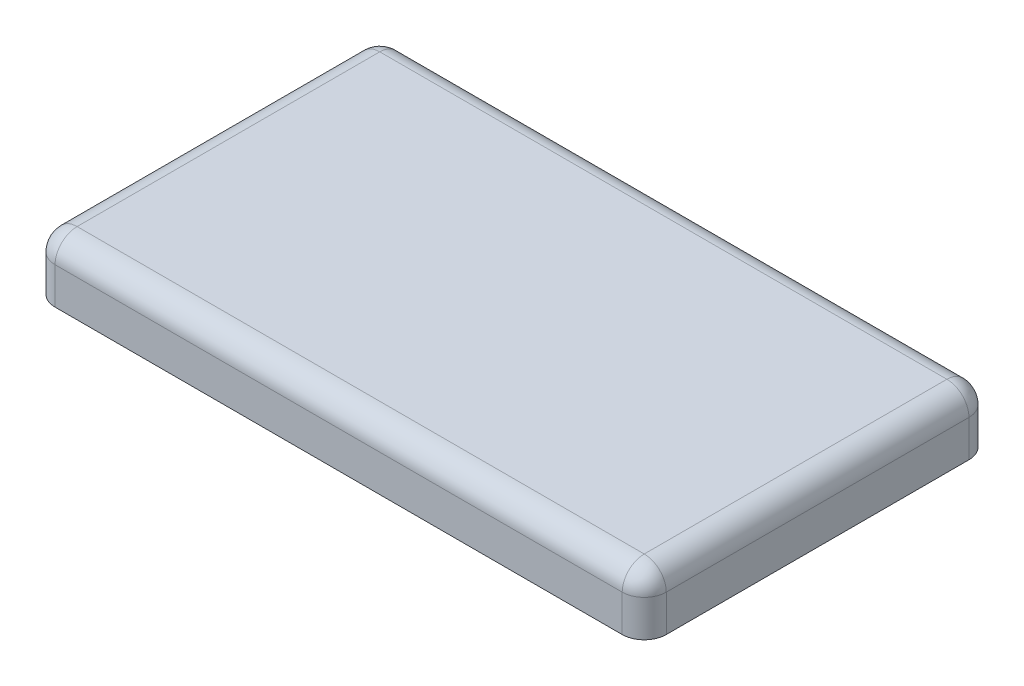
ISO-10303-21;
HEADER;
FILE_DESCRIPTION(('STEP AP214'),'2;1');
FILE_NAME('part.step','',(''),(''),'','','');
FILE_SCHEMA(('AUTOMOTIVE_DESIGN { 1 0 10303 214 1 1 1 1 }'));
ENDSEC;
DATA;
#1=APPLICATION_CONTEXT('core data for automotive mechanical design processes');
#2=APPLICATION_PROTOCOL_DEFINITION('international standard','automotive_design',2000,#1);
#3=PRODUCT_CONTEXT('',#1,'mechanical');
#4=PRODUCT('Part','Part','',(#3));
#5=PRODUCT_RELATED_PRODUCT_CATEGORY('part','',(#4));
#6=PRODUCT_DEFINITION_FORMATION('','',#4);
#7=PRODUCT_DEFINITION_CONTEXT('part definition',#1,'design');
#8=PRODUCT_DEFINITION('design','',#6,#7);
#9=PRODUCT_DEFINITION_SHAPE('','',#8);
#10=(LENGTH_UNIT() NAMED_UNIT(*) SI_UNIT(.MILLI.,.METRE.));
#11=(NAMED_UNIT(*) PLANE_ANGLE_UNIT() SI_UNIT($,.RADIAN.));
#12=(NAMED_UNIT(*) SI_UNIT($,.STERADIAN.) SOLID_ANGLE_UNIT());
#13=UNCERTAINTY_MEASURE_WITH_UNIT(LENGTH_MEASURE(1.E-05),#10,'distance_accuracy_value','');
#14=(GEOMETRIC_REPRESENTATION_CONTEXT(3) GLOBAL_UNCERTAINTY_ASSIGNED_CONTEXT((#13)) GLOBAL_UNIT_ASSIGNED_CONTEXT((#10,
#11,#12)) REPRESENTATION_CONTEXT('',''));
#15=CARTESIAN_POINT('',(0.,0.,0.));
#16=DIRECTION('',(0.,0.,1.));
#17=DIRECTION('',(1.,0.,0.));
#18=AXIS2_PLACEMENT_3D('',#15,#16,#17);
#19=CARTESIAN_POINT('',(0.,4.,0.));
#20=DIRECTION('',(1.,0.,0.));
#21=DIRECTION('',(0.,0.,-1.));
#22=AXIS2_PLACEMENT_3D('',#19,#20,#21);
#23=PLANE('',#22);
#24=DIRECTION('',(0.,0.,1.));
#25=VECTOR('',#24,1.);
#26=CARTESIAN_POINT('',(0.,0.,0.));
#27=LINE('',#26,#25);
#28=CARTESIAN_POINT('',(0.,0.,-22.1));
#29=VERTEX_POINT('',#28);
#30=CARTESIAN_POINT('',(0.,0.,-1.5));
#31=VERTEX_POINT('',#30);
#32=EDGE_CURVE('E176',#29,#31,#27,.T.);
#33=ORIENTED_EDGE('',*,*,#32,.T.);
#34=DIRECTION('',(0.,-1.,0.));
#35=VECTOR('',#34,1.);
#36=CARTESIAN_POINT('',(0.,4.,-1.5));
#37=LINE('',#36,#35);
#38=CARTESIAN_POINT('',(0.,2.5,-1.5));
#39=VERTEX_POINT('',#38);
#40=EDGE_CURVE('E52',#31,#39,#37,.F.);
#41=ORIENTED_EDGE('',*,*,#40,.T.);
#42=DIRECTION('',(0.,0.,1.));
#43=VECTOR('',#42,1.);
#44=CARTESIAN_POINT('',(0.,2.5,0.));
#45=LINE('',#44,#43);
#46=CARTESIAN_POINT('',(0.,2.5,-22.1));
#47=VERTEX_POINT('',#46);
#48=EDGE_CURVE('E57',#39,#47,#45,.F.);
#49=ORIENTED_EDGE('',*,*,#48,.T.);
#50=DIRECTION('',(0.,-1.,0.));
#51=VECTOR('',#50,1.);
#52=CARTESIAN_POINT('',(0.,4.,-22.1));
#53=LINE('',#52,#51);
#54=EDGE_CURVE('E218',#47,#29,#53,.T.);
#55=ORIENTED_EDGE('',*,*,#54,.T.);
#56=EDGE_LOOP('',(#33,#41,#49,#55));
#57=FACE_BOUND('',#56,.T.);
#58=ADVANCED_FACE('F35',(#57),#23,.F.);
#59=CARTESIAN_POINT('',(0.,4.,0.));
#60=DIRECTION('',(0.,0.,-1.));
#61=DIRECTION('',(-1.,0.,0.));
#62=AXIS2_PLACEMENT_3D('',#59,#60,#61);
#63=PLANE('',#62);
#64=DIRECTION('',(1.,0.,0.));
#65=VECTOR('',#64,1.);
#66=CARTESIAN_POINT('',(0.,2.5,0.));
#67=LINE('',#66,#65);
#68=CARTESIAN_POINT('',(40.1,2.5,0.));
#69=VERTEX_POINT('',#68);
#70=CARTESIAN_POINT('',(1.5,2.5,0.));
#71=VERTEX_POINT('',#70);
#72=EDGE_CURVE('E214',#69,#71,#67,.F.);
#73=ORIENTED_EDGE('',*,*,#72,.T.);
#74=DIRECTION('',(0.,-1.,0.));
#75=VECTOR('',#74,1.);
#76=CARTESIAN_POINT('',(1.5,4.,0.));
#77=LINE('',#76,#75);
#78=CARTESIAN_POINT('',(1.5,0.,0.));
#79=VERTEX_POINT('',#78);
#80=EDGE_CURVE('E216',#71,#79,#77,.T.);
#81=ORIENTED_EDGE('',*,*,#80,.T.);
#82=DIRECTION('',(1.,0.,0.));
#83=VECTOR('',#82,1.);
#84=CARTESIAN_POINT('',(0.,0.,0.));
#85=LINE('',#84,#83);
#86=CARTESIAN_POINT('',(40.1,0.,0.));
#87=VERTEX_POINT('',#86);
#88=EDGE_CURVE('E181',#79,#87,#85,.T.);
#89=ORIENTED_EDGE('',*,*,#88,.T.);
#90=DIRECTION('',(0.,-1.,0.));
#91=VECTOR('',#90,1.);
#92=CARTESIAN_POINT('',(40.1,4.,0.));
#93=LINE('',#92,#91);
#94=EDGE_CURVE('E212',#87,#69,#93,.F.);
#95=ORIENTED_EDGE('',*,*,#94,.T.);
#96=EDGE_LOOP('',(#73,#81,#89,#95));
#97=FACE_BOUND('',#96,.T.);
#98=ADVANCED_FACE('F283',(#97),#63,.F.);
#99=CARTESIAN_POINT('',(41.6,4.,0.));
#100=DIRECTION('',(-1.,0.,0.));
#101=DIRECTION('',(0.,0.,1.));
#102=AXIS2_PLACEMENT_3D('',#99,#100,#101);
#103=PLANE('',#102);
#104=DIRECTION('',(0.,0.,-1.));
#105=VECTOR('',#104,1.);
#106=CARTESIAN_POINT('',(41.6,0.,0.));
#107=LINE('',#106,#105);
#108=CARTESIAN_POINT('',(41.6,0.,-1.5));
#109=VERTEX_POINT('',#108);
#110=CARTESIAN_POINT('',(41.6,0.,-22.1));
#111=VERTEX_POINT('',#110);
#112=EDGE_CURVE('E184',#109,#111,#107,.T.);
#113=ORIENTED_EDGE('',*,*,#112,.T.);
#114=DIRECTION('',(0.,-1.,0.));
#115=VECTOR('',#114,1.);
#116=CARTESIAN_POINT('',(41.6,4.,-22.1));
#117=LINE('',#116,#115);
#118=CARTESIAN_POINT('',(41.6,2.5,-22.1));
#119=VERTEX_POINT('',#118);
#120=EDGE_CURVE('E210',#111,#119,#117,.F.);
#121=ORIENTED_EDGE('',*,*,#120,.T.);
#122=DIRECTION('',(0.,0.,-1.));
#123=VECTOR('',#122,1.);
#124=CARTESIAN_POINT('',(41.6,2.5,0.));
#125=LINE('',#124,#123);
#126=CARTESIAN_POINT('',(41.6,2.5,-1.5));
#127=VERTEX_POINT('',#126);
#128=EDGE_CURVE('E208',#119,#127,#125,.F.);
#129=ORIENTED_EDGE('',*,*,#128,.T.);
#130=DIRECTION('',(0.,-1.,0.));
#131=VECTOR('',#130,1.);
#132=CARTESIAN_POINT('',(41.6,4.,-1.5));
#133=LINE('',#132,#131);
#134=EDGE_CURVE('E206',#127,#109,#133,.T.);
#135=ORIENTED_EDGE('',*,*,#134,.T.);
#136=EDGE_LOOP('',(#113,#121,#129,#135));
#137=FACE_BOUND('',#136,.T.);
#138=ADVANCED_FACE('F316',(#137),#103,.F.);
#139=CARTESIAN_POINT('',(0.,4.,-23.6));
#140=DIRECTION('',(0.,0.,1.));
#141=DIRECTION('',(1.,0.,0.));
#142=AXIS2_PLACEMENT_3D('',#139,#140,#141);
#143=PLANE('',#142);
#144=DIRECTION('',(-1.,0.,0.));
#145=VECTOR('',#144,1.);
#146=CARTESIAN_POINT('',(0.,0.,-23.6));
#147=LINE('',#146,#145);
#148=CARTESIAN_POINT('',(40.1,0.,-23.6));
#149=VERTEX_POINT('',#148);
#150=CARTESIAN_POINT('',(1.49999999999999,0.,-23.6));
#151=VERTEX_POINT('',#150);
#152=EDGE_CURVE('E187',#149,#151,#147,.T.);
#153=ORIENTED_EDGE('',*,*,#152,.T.);
#154=DIRECTION('',(0.,-1.,0.));
#155=VECTOR('',#154,1.);
#156=CARTESIAN_POINT('',(1.49999999999999,4.,-23.6));
#157=LINE('',#156,#155);
#158=CARTESIAN_POINT('',(1.49999999999999,2.5,-23.6));
#159=VERTEX_POINT('',#158);
#160=EDGE_CURVE('E204',#151,#159,#157,.F.);
#161=ORIENTED_EDGE('',*,*,#160,.T.);
#162=DIRECTION('',(-1.,0.,0.));
#163=VECTOR('',#162,1.);
#164=CARTESIAN_POINT('',(0.,2.5,-23.6));
#165=LINE('',#164,#163);
#166=CARTESIAN_POINT('',(40.1,2.5,-23.6));
#167=VERTEX_POINT('',#166);
#168=EDGE_CURVE('E201',#159,#167,#165,.F.);
#169=ORIENTED_EDGE('',*,*,#168,.T.);
#170=DIRECTION('',(0.,-1.,0.));
#171=VECTOR('',#170,1.);
#172=CARTESIAN_POINT('',(40.1,4.,-23.6));
#173=LINE('',#172,#171);
#174=EDGE_CURVE('E199',#167,#149,#173,.T.);
#175=ORIENTED_EDGE('',*,*,#174,.T.);
#176=EDGE_LOOP('',(#153,#161,#169,#175));
#177=FACE_BOUND('',#176,.T.);
#178=ADVANCED_FACE('F307',(#177),#143,.F.);
#179=CARTESIAN_POINT('',(0.,4.,0.));
#180=DIRECTION('',(0.,-1.,0.));
#181=DIRECTION('',(0.,0.,-1.));
#182=AXIS2_PLACEMENT_3D('',#179,#180,#181);
#183=PLANE('',#182);
#184=DIRECTION('',(0.,0.,-1.));
#185=VECTOR('',#184,1.);
#186=CARTESIAN_POINT('',(40.1,4.,0.));
#187=LINE('',#186,#185);
#188=CARTESIAN_POINT('',(40.1,4.,-1.5));
#189=VERTEX_POINT('',#188);
#190=CARTESIAN_POINT('',(40.1,4.,-22.1));
#191=VERTEX_POINT('',#190);
#192=EDGE_CURVE('E194',#189,#191,#187,.T.);
#193=ORIENTED_EDGE('',*,*,#192,.T.);
#194=DIRECTION('',(-1.,0.,0.));
#195=VECTOR('',#194,1.);
#196=CARTESIAN_POINT('',(0.,4.,-22.1));
#197=LINE('',#196,#195);
#198=CARTESIAN_POINT('',(1.49999999999999,4.,-22.1));
#199=VERTEX_POINT('',#198);
#200=EDGE_CURVE('E196',#191,#199,#197,.T.);
#201=ORIENTED_EDGE('',*,*,#200,.T.);
#202=DIRECTION('',(0.,0.,1.));
#203=VECTOR('',#202,1.);
#204=CARTESIAN_POINT('',(1.5,4.,0.));
#205=LINE('',#204,#203);
#206=CARTESIAN_POINT('',(1.5,4.,-1.5));
#207=VERTEX_POINT('',#206);
#208=EDGE_CURVE('E190',#199,#207,#205,.T.);
#209=ORIENTED_EDGE('',*,*,#208,.T.);
#210=DIRECTION('',(1.,0.,0.));
#211=VECTOR('',#210,1.);
#212=CARTESIAN_POINT('',(0.,4.,-1.5));
#213=LINE('',#212,#211);
#214=EDGE_CURVE('E192',#207,#189,#213,.T.);
#215=ORIENTED_EDGE('',*,*,#214,.T.);
#216=EDGE_LOOP('',(#193,#201,#209,#215));
#217=FACE_BOUND('',#216,.T.);
#218=ADVANCED_FACE('F273',(#217),#183,.F.);
#219=CARTESIAN_POINT('',(0.,0.,0.));
#220=DIRECTION('',(0.,-1.,0.));
#221=DIRECTION('',(0.,0.,-1.));
#222=AXIS2_PLACEMENT_3D('',#219,#220,#221);
#223=PLANE('',#222);
#224=DIRECTION('',(0.,0.,1.));
#225=VECTOR('',#224,1.);
#226=CARTESIAN_POINT('',(40.05,0.,-22.05));
#227=LINE('',#226,#225);
#228=CARTESIAN_POINT('',(40.05,0.,-22.05));
#229=VERTEX_POINT('',#228);
#230=CARTESIAN_POINT('',(40.05,0.,-1.55));
#231=VERTEX_POINT('',#230);
#232=EDGE_CURVE('E144',#229,#231,#227,.T.);
#233=ORIENTED_EDGE('',*,*,#232,.F.);
#234=DIRECTION('',(1.,0.,0.));
#235=VECTOR('',#234,1.);
#236=CARTESIAN_POINT('',(1.54999999999999,0.,-22.05));
#237=LINE('',#236,#235);
#238=CARTESIAN_POINT('',(1.54999999999999,0.,-22.05));
#239=VERTEX_POINT('',#238);
#240=EDGE_CURVE('E161',#239,#229,#237,.T.);
#241=ORIENTED_EDGE('',*,*,#240,.F.);
#242=DIRECTION('',(0.,0.,-1.));
#243=VECTOR('',#242,1.);
#244=CARTESIAN_POINT('',(1.54999999999999,0.,-22.05));
#245=LINE('',#244,#243);
#246=CARTESIAN_POINT('',(1.54999999999999,0.,-1.55));
#247=VERTEX_POINT('',#246);
#248=EDGE_CURVE('E164',#247,#239,#245,.T.);
#249=ORIENTED_EDGE('',*,*,#248,.F.);
#250=DIRECTION('',(-1.,0.,0.));
#251=VECTOR('',#250,1.);
#252=CARTESIAN_POINT('',(1.54999999999999,0.,-1.55));
#253=LINE('',#252,#251);
#254=EDGE_CURVE('E170',#231,#247,#253,.T.);
#255=ORIENTED_EDGE('',*,*,#254,.F.);
#256=EDGE_LOOP('',(#233,#241,#249,#255));
#257=FACE_BOUND('',#256,.T.);
#258=ORIENTED_EDGE('',*,*,#88,.F.);
#259=CARTESIAN_POINT('',(1.5,0.,-1.5));
#260=DIRECTION('',(0.,-1.,0.));
#261=DIRECTION('',(0.,0.,-1.));
#262=AXIS2_PLACEMENT_3D('',#259,#260,#261);
#263=CIRCLE('',#262,1.5);
#264=EDGE_CURVE('E11',#79,#31,#263,.T.);
#265=ORIENTED_EDGE('',*,*,#264,.T.);
#266=ORIENTED_EDGE('',*,*,#32,.F.);
#267=CARTESIAN_POINT('',(1.49999999999999,0.,-22.1));
#268=DIRECTION('',(0.,-1.,0.));
#269=DIRECTION('',(0.,0.,-1.));
#270=AXIS2_PLACEMENT_3D('',#267,#268,#269);
#271=CIRCLE('',#270,1.5);
#272=EDGE_CURVE('E44',#29,#151,#271,.T.);
#273=ORIENTED_EDGE('',*,*,#272,.T.);
#274=ORIENTED_EDGE('',*,*,#152,.F.);
#275=CARTESIAN_POINT('',(40.1,0.,-22.1));
#276=DIRECTION('',(0.,-1.,0.));
#277=DIRECTION('',(0.,0.,-1.));
#278=AXIS2_PLACEMENT_3D('',#275,#276,#277);
#279=CIRCLE('',#278,1.5);
#280=EDGE_CURVE('E224',#149,#111,#279,.T.);
#281=ORIENTED_EDGE('',*,*,#280,.T.);
#282=ORIENTED_EDGE('',*,*,#112,.F.);
#283=CARTESIAN_POINT('',(40.1,0.,-1.5));
#284=DIRECTION('',(0.,-1.,0.));
#285=DIRECTION('',(0.,0.,-1.));
#286=AXIS2_PLACEMENT_3D('',#283,#284,#285);
#287=CIRCLE('',#286,1.5);
#288=EDGE_CURVE('E222',#109,#87,#287,.T.);
#289=ORIENTED_EDGE('',*,*,#288,.T.);
#290=EDGE_LOOP('',(#258,#265,#266,#273,#274,#281,#282,#289));
#291=FACE_BOUND('',#290,.T.);
#292=ADVANCED_FACE('F291',(#257,#291),#223,.T.);
#293=CARTESIAN_POINT('',(40.05,2.6,-22.05));
#294=DIRECTION('',(1.,0.,0.));
#295=DIRECTION('',(0.,0.,-1.));
#296=AXIS2_PLACEMENT_3D('',#293,#294,#295);
#297=PLANE('',#296);
#298=ORIENTED_EDGE('',*,*,#232,.T.);
#299=DIRECTION('',(0.,-1.,0.));
#300=VECTOR('',#299,1.);
#301=CARTESIAN_POINT('',(40.05,2.6,-1.55));
#302=LINE('',#301,#300);
#303=CARTESIAN_POINT('',(40.05,2.6,-1.55));
#304=VERTEX_POINT('',#303);
#305=EDGE_CURVE('E137',#304,#231,#302,.T.);
#306=ORIENTED_EDGE('',*,*,#305,.F.);
#307=DIRECTION('',(0.,0.,1.));
#308=VECTOR('',#307,1.);
#309=CARTESIAN_POINT('',(40.05,2.6,-22.05));
#310=LINE('',#309,#308);
#311=CARTESIAN_POINT('',(40.05,2.6,-22.05));
#312=VERTEX_POINT('',#311);
#313=EDGE_CURVE('E141',#312,#304,#310,.T.);
#314=ORIENTED_EDGE('',*,*,#313,.F.);
#315=DIRECTION('',(0.,-1.,0.));
#316=VECTOR('',#315,1.);
#317=CARTESIAN_POINT('',(40.05,2.6,-22.05));
#318=LINE('',#317,#316);
#319=EDGE_CURVE('E174',#312,#229,#318,.T.);
#320=ORIENTED_EDGE('',*,*,#319,.T.);
#321=EDGE_LOOP('',(#298,#306,#314,#320));
#322=FACE_BOUND('',#321,.T.);
#323=ADVANCED_FACE('F139',(#322),#297,.F.);
#324=CARTESIAN_POINT('',(1.54999999999999,2.6,-22.05));
#325=DIRECTION('',(0.,0.,-1.));
#326=DIRECTION('',(-1.,0.,0.));
#327=AXIS2_PLACEMENT_3D('',#324,#325,#326);
#328=PLANE('',#327);
#329=ORIENTED_EDGE('',*,*,#240,.T.);
#330=ORIENTED_EDGE('',*,*,#319,.F.);
#331=DIRECTION('',(1.,0.,0.));
#332=VECTOR('',#331,1.);
#333=CARTESIAN_POINT('',(1.54999999999999,2.6,-22.05));
#334=LINE('',#333,#332);
#335=CARTESIAN_POINT('',(1.54999999999999,2.6,-22.05));
#336=VERTEX_POINT('',#335);
#337=EDGE_CURVE('E149',#336,#312,#334,.T.);
#338=ORIENTED_EDGE('',*,*,#337,.F.);
#339=DIRECTION('',(0.,-1.,0.));
#340=VECTOR('',#339,1.);
#341=CARTESIAN_POINT('',(1.54999999999999,2.6,-22.05));
#342=LINE('',#341,#340);
#343=EDGE_CURVE('E177',#336,#239,#342,.T.);
#344=ORIENTED_EDGE('',*,*,#343,.T.);
#345=EDGE_LOOP('',(#329,#330,#338,#344));
#346=FACE_BOUND('',#345,.T.);
#347=ADVANCED_FACE('F445',(#346),#328,.F.);
#348=CARTESIAN_POINT('',(1.54999999999999,2.6,-22.05));
#349=DIRECTION('',(-1.,0.,0.));
#350=DIRECTION('',(0.,0.,1.));
#351=AXIS2_PLACEMENT_3D('',#348,#349,#350);
#352=PLANE('',#351);
#353=ORIENTED_EDGE('',*,*,#248,.T.);
#354=ORIENTED_EDGE('',*,*,#343,.F.);
#355=DIRECTION('',(0.,0.,-1.));
#356=VECTOR('',#355,1.);
#357=CARTESIAN_POINT('',(1.54999999999999,2.6,-22.05));
#358=LINE('',#357,#356);
#359=CARTESIAN_POINT('',(1.54999999999999,2.6,-1.55));
#360=VERTEX_POINT('',#359);
#361=EDGE_CURVE('E157',#360,#336,#358,.T.);
#362=ORIENTED_EDGE('',*,*,#361,.F.);
#363=DIRECTION('',(0.,-1.,0.));
#364=VECTOR('',#363,1.);
#365=CARTESIAN_POINT('',(1.54999999999999,2.6,-1.55));
#366=LINE('',#365,#364);
#367=EDGE_CURVE('E148',#360,#247,#366,.T.);
#368=ORIENTED_EDGE('',*,*,#367,.T.);
#369=EDGE_LOOP('',(#353,#354,#362,#368));
#370=FACE_BOUND('',#369,.T.);
#371=ADVANCED_FACE('F437',(#370),#352,.F.);
#372=CARTESIAN_POINT('',(1.54999999999999,2.6,-1.55));
#373=DIRECTION('',(0.,0.,1.));
#374=DIRECTION('',(1.,0.,0.));
#375=AXIS2_PLACEMENT_3D('',#372,#373,#374);
#376=PLANE('',#375);
#377=ORIENTED_EDGE('',*,*,#254,.T.);
#378=ORIENTED_EDGE('',*,*,#367,.F.);
#379=DIRECTION('',(-1.,0.,0.));
#380=VECTOR('',#379,1.);
#381=CARTESIAN_POINT('',(1.54999999999999,2.6,-1.55));
#382=LINE('',#381,#380);
#383=EDGE_CURVE('E152',#304,#360,#382,.T.);
#384=ORIENTED_EDGE('',*,*,#383,.F.);
#385=ORIENTED_EDGE('',*,*,#305,.T.);
#386=EDGE_LOOP('',(#377,#378,#384,#385));
#387=FACE_BOUND('',#386,.T.);
#388=ADVANCED_FACE('F153',(#387),#376,.F.);
#389=CARTESIAN_POINT('',(0.,2.6,0.));
#390=DIRECTION('',(0.,1.,0.));
#391=DIRECTION('',(0.,0.,1.));
#392=AXIS2_PLACEMENT_3D('',#389,#390,#391);
#393=PLANE('',#392);
#394=ORIENTED_EDGE('',*,*,#313,.T.);
#395=ORIENTED_EDGE('',*,*,#383,.T.);
#396=ORIENTED_EDGE('',*,*,#361,.T.);
#397=ORIENTED_EDGE('',*,*,#337,.T.);
#398=EDGE_LOOP('',(#394,#395,#396,#397));
#399=FACE_BOUND('',#398,.T.);
#400=ADVANCED_FACE('F159',(#399),#393,.F.);
#401=CARTESIAN_POINT('',(40.1,4.,-1.5));
#402=DIRECTION('',(0.,-1.,0.));
#403=DIRECTION('',(0.,0.,-1.));
#404=AXIS2_PLACEMENT_3D('',#401,#402,#403);
#405=CYLINDRICAL_SURFACE('',#404,1.5);
#406=ORIENTED_EDGE('',*,*,#288,.F.);
#407=ORIENTED_EDGE('',*,*,#134,.F.);
#408=CARTESIAN_POINT('',(40.1,2.5,-1.5));
#409=DIRECTION('',(0.,1.,0.));
#410=DIRECTION('',(0.,0.,1.));
#411=AXIS2_PLACEMENT_3D('',#408,#409,#410);
#412=CIRCLE('',#411,1.5);
#413=EDGE_CURVE('E39',#69,#127,#412,.T.);
#414=ORIENTED_EDGE('',*,*,#413,.F.);
#415=ORIENTED_EDGE('',*,*,#94,.F.);
#416=EDGE_LOOP('',(#406,#407,#414,#415));
#417=FACE_BOUND('',#416,.T.);
#418=ADVANCED_FACE('F37',(#417),#405,.T.);
#419=CARTESIAN_POINT('',(0.,2.5,-1.5));
#420=DIRECTION('',(1.,0.,0.));
#421=DIRECTION('',(0.,0.,-1.));
#422=AXIS2_PLACEMENT_3D('',#419,#420,#421);
#423=CYLINDRICAL_SURFACE('',#422,1.5);
#424=CARTESIAN_POINT('',(1.5,2.5,-1.5));
#425=DIRECTION('',(-1.,0.,0.));
#426=DIRECTION('',(0.,0.,1.));
#427=AXIS2_PLACEMENT_3D('',#424,#425,#426);
#428=CIRCLE('',#427,1.5);
#429=EDGE_CURVE('E252',#71,#207,#428,.T.);
#430=ORIENTED_EDGE('',*,*,#429,.F.);
#431=ORIENTED_EDGE('',*,*,#72,.F.);
#432=CARTESIAN_POINT('',(40.1,2.5,-1.5));
#433=DIRECTION('',(1.,0.,0.));
#434=DIRECTION('',(0.,0.,-1.));
#435=AXIS2_PLACEMENT_3D('',#432,#433,#434);
#436=CIRCLE('',#435,1.5);
#437=EDGE_CURVE('E254',#189,#69,#436,.T.);
#438=ORIENTED_EDGE('',*,*,#437,.F.);
#439=ORIENTED_EDGE('',*,*,#214,.F.);
#440=EDGE_LOOP('',(#430,#431,#438,#439));
#441=FACE_BOUND('',#440,.T.);
#442=ADVANCED_FACE('F280',(#441),#423,.T.);
#443=CARTESIAN_POINT('',(1.5,4.,-1.5));
#444=DIRECTION('',(0.,-1.,0.));
#445=DIRECTION('',(0.,0.,-1.));
#446=AXIS2_PLACEMENT_3D('',#443,#444,#445);
#447=CYLINDRICAL_SURFACE('',#446,1.5);
#448=ORIENTED_EDGE('',*,*,#264,.F.);
#449=ORIENTED_EDGE('',*,*,#80,.F.);
#450=CARTESIAN_POINT('',(1.5,2.5,-1.5));
#451=DIRECTION('',(0.,1.,0.));
#452=DIRECTION('',(0.,0.,1.));
#453=AXIS2_PLACEMENT_3D('',#450,#451,#452);
#454=CIRCLE('',#453,1.5);
#455=EDGE_CURVE('E249',#39,#71,#454,.T.);
#456=ORIENTED_EDGE('',*,*,#455,.F.);
#457=ORIENTED_EDGE('',*,*,#40,.F.);
#458=EDGE_LOOP('',(#448,#449,#456,#457));
#459=FACE_BOUND('',#458,.T.);
#460=ADVANCED_FACE('F287',(#459),#447,.T.);
#461=CARTESIAN_POINT('',(40.1,2.5,-1.5));
#462=DIRECTION('',(0.,0.,1.));
#463=DIRECTION('',(1.,0.,0.));
#464=AXIS2_PLACEMENT_3D('',#461,#462,#463);
#465=SPHERICAL_SURFACE('',#464,1.5);
#466=ORIENTED_EDGE('',*,*,#437,.T.);
#467=ORIENTED_EDGE('',*,*,#413,.T.);
#468=CARTESIAN_POINT('',(40.1,2.5,-1.5));
#469=DIRECTION('',(0.,0.,1.));
#470=DIRECTION('',(1.,0.,0.));
#471=AXIS2_PLACEMENT_3D('',#468,#469,#470);
#472=CIRCLE('',#471,1.5);
#473=EDGE_CURVE('E246',#189,#127,#472,.F.);
#474=ORIENTED_EDGE('',*,*,#473,.F.);
#475=EDGE_LOOP('',(#466,#467,#474));
#476=FACE_BOUND('',#475,.T.);
#477=ADVANCED_FACE('F261',(#476),#465,.T.);
#478=CARTESIAN_POINT('',(1.5,2.5,-1.5));
#479=DIRECTION('',(0.,0.,1.));
#480=DIRECTION('',(1.,0.,0.));
#481=AXIS2_PLACEMENT_3D('',#478,#479,#480);
#482=SPHERICAL_SURFACE('',#481,1.5);
#483=ORIENTED_EDGE('',*,*,#455,.T.);
#484=ORIENTED_EDGE('',*,*,#429,.T.);
#485=CARTESIAN_POINT('',(1.5,2.5,-1.5));
#486=DIRECTION('',(0.,0.,1.));
#487=DIRECTION('',(1.,0.,0.));
#488=AXIS2_PLACEMENT_3D('',#485,#486,#487);
#489=CIRCLE('',#488,1.5);
#490=EDGE_CURVE('E243',#39,#207,#489,.F.);
#491=ORIENTED_EDGE('',*,*,#490,.F.);
#492=EDGE_LOOP('',(#483,#484,#491));
#493=FACE_BOUND('',#492,.T.);
#494=ADVANCED_FACE('F348',(#493),#482,.T.);
#495=CARTESIAN_POINT('',(40.1,4.,-22.1));
#496=DIRECTION('',(0.,-1.,0.));
#497=DIRECTION('',(0.,0.,-1.));
#498=AXIS2_PLACEMENT_3D('',#495,#496,#497);
#499=CYLINDRICAL_SURFACE('',#498,1.5);
#500=ORIENTED_EDGE('',*,*,#280,.F.);
#501=ORIENTED_EDGE('',*,*,#174,.F.);
#502=CARTESIAN_POINT('',(40.1,2.5,-22.1));
#503=DIRECTION('',(0.,1.,0.));
#504=DIRECTION('',(0.,0.,1.));
#505=AXIS2_PLACEMENT_3D('',#502,#503,#504);
#506=CIRCLE('',#505,1.5);
#507=EDGE_CURVE('E240',#119,#167,#506,.T.);
#508=ORIENTED_EDGE('',*,*,#507,.F.);
#509=ORIENTED_EDGE('',*,*,#120,.F.);
#510=EDGE_LOOP('',(#500,#501,#508,#509));
#511=FACE_BOUND('',#510,.T.);
#512=ADVANCED_FACE('F314',(#511),#499,.T.);
#513=CARTESIAN_POINT('',(40.1,2.5,0.));
#514=DIRECTION('',(0.,0.,-1.));
#515=DIRECTION('',(-1.,0.,0.));
#516=AXIS2_PLACEMENT_3D('',#513,#514,#515);
#517=CYLINDRICAL_SURFACE('',#516,1.5);
#518=ORIENTED_EDGE('',*,*,#473,.T.);
#519=ORIENTED_EDGE('',*,*,#128,.F.);
#520=CARTESIAN_POINT('',(40.1,2.5,-22.1));
#521=DIRECTION('',(0.,0.,-1.));
#522=DIRECTION('',(-1.,0.,0.));
#523=AXIS2_PLACEMENT_3D('',#520,#521,#522);
#524=CIRCLE('',#523,1.5);
#525=EDGE_CURVE('E237',#191,#119,#524,.T.);
#526=ORIENTED_EDGE('',*,*,#525,.F.);
#527=ORIENTED_EDGE('',*,*,#192,.F.);
#528=EDGE_LOOP('',(#518,#519,#526,#527));
#529=FACE_BOUND('',#528,.T.);
#530=ADVANCED_FACE('F268',(#529),#517,.T.);
#531=CARTESIAN_POINT('',(1.5,2.5,0.));
#532=DIRECTION('',(0.,0.,1.));
#533=DIRECTION('',(1.,0.,0.));
#534=AXIS2_PLACEMENT_3D('',#531,#532,#533);
#535=CYLINDRICAL_SURFACE('',#534,1.5);
#536=ORIENTED_EDGE('',*,*,#490,.T.);
#537=ORIENTED_EDGE('',*,*,#208,.F.);
#538=CARTESIAN_POINT('',(1.49999999999999,2.5,-22.1));
#539=DIRECTION('',(0.,0.,-1.));
#540=DIRECTION('',(-1.,0.,0.));
#541=AXIS2_PLACEMENT_3D('',#538,#539,#540);
#542=CIRCLE('',#541,1.5);
#543=EDGE_CURVE('E234',#47,#199,#542,.T.);
#544=ORIENTED_EDGE('',*,*,#543,.F.);
#545=ORIENTED_EDGE('',*,*,#48,.F.);
#546=EDGE_LOOP('',(#536,#537,#544,#545));
#547=FACE_BOUND('',#546,.T.);
#548=ADVANCED_FACE('F300',(#547),#535,.T.);
#549=CARTESIAN_POINT('',(1.49999999999999,4.,-22.1));
#550=DIRECTION('',(0.,-1.,0.));
#551=DIRECTION('',(0.,0.,-1.));
#552=AXIS2_PLACEMENT_3D('',#549,#550,#551);
#553=CYLINDRICAL_SURFACE('',#552,1.5);
#554=ORIENTED_EDGE('',*,*,#272,.F.);
#555=ORIENTED_EDGE('',*,*,#54,.F.);
#556=CARTESIAN_POINT('',(1.49999999999999,2.5,-22.1));
#557=DIRECTION('',(0.,1.,0.));
#558=DIRECTION('',(0.,0.,1.));
#559=AXIS2_PLACEMENT_3D('',#556,#557,#558);
#560=CIRCLE('',#559,1.5);
#561=EDGE_CURVE('E231',#159,#47,#560,.T.);
#562=ORIENTED_EDGE('',*,*,#561,.F.);
#563=ORIENTED_EDGE('',*,*,#160,.F.);
#564=EDGE_LOOP('',(#554,#555,#562,#563));
#565=FACE_BOUND('',#564,.T.);
#566=ADVANCED_FACE('F296',(#565),#553,.T.);
#567=CARTESIAN_POINT('',(40.1,2.5,-22.1));
#568=DIRECTION('',(0.,0.,1.));
#569=DIRECTION('',(1.,0.,0.));
#570=AXIS2_PLACEMENT_3D('',#567,#568,#569);
#571=SPHERICAL_SURFACE('',#570,1.5);
#572=ORIENTED_EDGE('',*,*,#525,.T.);
#573=ORIENTED_EDGE('',*,*,#507,.T.);
#574=CARTESIAN_POINT('',(40.1,2.5,-22.1));
#575=DIRECTION('',(1.,0.,0.));
#576=DIRECTION('',(0.,0.,-1.));
#577=AXIS2_PLACEMENT_3D('',#574,#575,#576);
#578=CIRCLE('',#577,1.5);
#579=EDGE_CURVE('E229',#191,#167,#578,.F.);
#580=ORIENTED_EDGE('',*,*,#579,.F.);
#581=EDGE_LOOP('',(#572,#573,#580));
#582=FACE_BOUND('',#581,.T.);
#583=ADVANCED_FACE('F336',(#582),#571,.T.);
#584=CARTESIAN_POINT('',(1.49999999999999,2.5,-22.1));
#585=DIRECTION('',(0.,0.,1.));
#586=DIRECTION('',(1.,0.,0.));
#587=AXIS2_PLACEMENT_3D('',#584,#585,#586);
#588=SPHERICAL_SURFACE('',#587,1.5);
#589=ORIENTED_EDGE('',*,*,#561,.T.);
#590=ORIENTED_EDGE('',*,*,#543,.T.);
#591=CARTESIAN_POINT('',(1.49999999999999,2.5,-22.1));
#592=DIRECTION('',(-1.,0.,0.));
#593=DIRECTION('',(0.,0.,1.));
#594=AXIS2_PLACEMENT_3D('',#591,#592,#593);
#595=CIRCLE('',#594,1.5);
#596=EDGE_CURVE('E227',#159,#199,#595,.F.);
#597=ORIENTED_EDGE('',*,*,#596,.F.);
#598=EDGE_LOOP('',(#589,#590,#597));
#599=FACE_BOUND('',#598,.T.);
#600=ADVANCED_FACE('F303',(#599),#588,.T.);
#601=CARTESIAN_POINT('',(0.,2.5,-22.1));
#602=DIRECTION('',(-1.,0.,0.));
#603=DIRECTION('',(0.,0.,1.));
#604=AXIS2_PLACEMENT_3D('',#601,#602,#603);
#605=CYLINDRICAL_SURFACE('',#604,1.5);
#606=ORIENTED_EDGE('',*,*,#579,.T.);
#607=ORIENTED_EDGE('',*,*,#168,.F.);
#608=ORIENTED_EDGE('',*,*,#596,.T.);
#609=ORIENTED_EDGE('',*,*,#200,.F.);
#610=EDGE_LOOP('',(#606,#607,#608,#609));
#611=FACE_BOUND('',#610,.T.);
#612=ADVANCED_FACE('F305',(#611),#605,.T.);
#613=CLOSED_SHELL('',(#58,#98,#138,#178,#218,#292,#323,#347,#371,#388,#400,#418,#442,#460,#477,
#494,#512,#530,#548,#566,#583,#600,#612));
#614=MANIFOLD_SOLID_BREP('B2',#613);
#615=ADVANCED_BREP_SHAPE_REPRESENTATION('',(#18,#614),#14);
#616=SHAPE_DEFINITION_REPRESENTATION(#9,#615);
ENDSEC;
END-ISO-10303-21;
